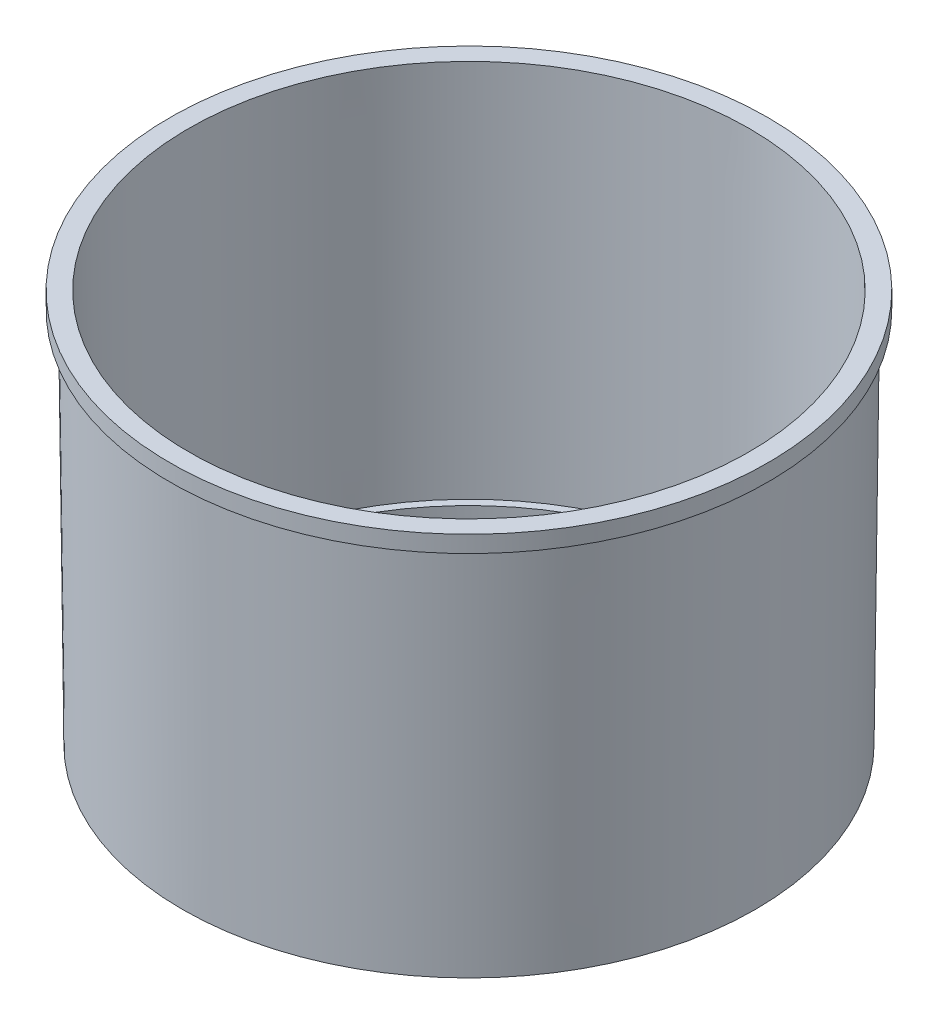
ISO-10303-21;
HEADER;
FILE_DESCRIPTION(('STEP AP214'),'2;1');
FILE_NAME('part.step','',(''),(''),'','','');
FILE_SCHEMA(('AUTOMOTIVE_DESIGN { 1 0 10303 214 1 1 1 1 }'));
ENDSEC;
DATA;
#1=APPLICATION_CONTEXT('core data for automotive mechanical design processes');
#2=APPLICATION_PROTOCOL_DEFINITION('international standard','automotive_design',2000,#1);
#3=PRODUCT_CONTEXT('',#1,'mechanical');
#4=PRODUCT('Part','Part','',(#3));
#5=PRODUCT_RELATED_PRODUCT_CATEGORY('part','',(#4));
#6=PRODUCT_DEFINITION_FORMATION('','',#4);
#7=PRODUCT_DEFINITION_CONTEXT('part definition',#1,'design');
#8=PRODUCT_DEFINITION('design','',#6,#7);
#9=PRODUCT_DEFINITION_SHAPE('','',#8);
#10=(LENGTH_UNIT() NAMED_UNIT(*) SI_UNIT(.MILLI.,.METRE.));
#11=(NAMED_UNIT(*) PLANE_ANGLE_UNIT() SI_UNIT($,.RADIAN.));
#12=(NAMED_UNIT(*) SI_UNIT($,.STERADIAN.) SOLID_ANGLE_UNIT());
#13=UNCERTAINTY_MEASURE_WITH_UNIT(LENGTH_MEASURE(1.E-05),#10,'distance_accuracy_value','');
#14=(GEOMETRIC_REPRESENTATION_CONTEXT(3) GLOBAL_UNCERTAINTY_ASSIGNED_CONTEXT((#13)) GLOBAL_UNIT_ASSIGNED_CONTEXT((#10,
#11,#12)) REPRESENTATION_CONTEXT('',''));
#15=CARTESIAN_POINT('',(0.,0.,0.));
#16=DIRECTION('',(0.,0.,1.));
#17=DIRECTION('',(1.,0.,0.));
#18=AXIS2_PLACEMENT_3D('',#15,#16,#17);
#19=CARTESIAN_POINT('',(-32.1,0.,0.));
#20=DIRECTION('',(0.,1.,0.));
#21=DIRECTION('',(0.,0.,1.));
#22=AXIS2_PLACEMENT_3D('',#19,#20,#21);
#23=PLANE('',#22);
#24=CARTESIAN_POINT('',(0.,0.,0.));
#25=DIRECTION('',(0.,-1.,0.));
#26=DIRECTION('',(0.,0.,-1.));
#27=AXIS2_PLACEMENT_3D('',#24,#25,#26);
#28=CIRCLE('',#27,32.1);
#29=CARTESIAN_POINT('',(0.,0.,-32.1));
#30=VERTEX_POINT('',#29);
#31=EDGE_CURVE('E10',#30,#30,#28,.T.);
#32=ORIENTED_EDGE('',*,*,#31,.F.);
#33=EDGE_LOOP('',(#32));
#34=FACE_BOUND('',#33,.T.);
#35=CARTESIAN_POINT('',(0.,0.,0.));
#36=DIRECTION('',(0.,-1.,0.));
#37=DIRECTION('',(0.,0.,-1.));
#38=AXIS2_PLACEMENT_3D('',#35,#36,#37);
#39=CIRCLE('',#38,34.25);
#40=CARTESIAN_POINT('',(0.,0.,-34.25));
#41=VERTEX_POINT('',#40);
#42=EDGE_CURVE('E62',#41,#41,#39,.T.);
#43=ORIENTED_EDGE('',*,*,#42,.T.);
#44=EDGE_LOOP('',(#43));
#45=FACE_BOUND('',#44,.T.);
#46=ADVANCED_FACE('F34',(#34,#45),#23,.F.);
#47=CARTESIAN_POINT('',(0.,-2.25,0.));
#48=DIRECTION('',(0.,-1.,0.));
#49=DIRECTION('',(0.,0.,-1.));
#50=AXIS2_PLACEMENT_3D('',#47,#48,#49);
#51=CYLINDRICAL_SURFACE('',#50,32.1);
#52=CARTESIAN_POINT('',(0.,2.,0.));
#53=DIRECTION('',(0.,-1.,0.));
#54=DIRECTION('',(0.,0.,-1.));
#55=AXIS2_PLACEMENT_3D('',#52,#53,#54);
#56=CIRCLE('',#55,32.1);
#57=CARTESIAN_POINT('',(0.,2.,-32.1));
#58=VERTEX_POINT('',#57);
#59=EDGE_CURVE('E40',#58,#58,#56,.T.);
#60=ORIENTED_EDGE('',*,*,#59,.F.);
#61=EDGE_LOOP('',(#60));
#62=FACE_BOUND('',#61,.T.);
#63=ORIENTED_EDGE('',*,*,#31,.T.);
#64=EDGE_LOOP('',(#63));
#65=FACE_BOUND('',#64,.T.);
#66=ADVANCED_FACE('F99',(#62,#65),#51,.F.);
#67=CARTESIAN_POINT('',(-33.0212088550612,2.,0.));
#68=DIRECTION('',(0.,-1.,0.));
#69=DIRECTION('',(0.,0.,-1.));
#70=AXIS2_PLACEMENT_3D('',#67,#68,#69);
#71=PLANE('',#70);
#72=CARTESIAN_POINT('',(0.,2.,0.));
#73=DIRECTION('',(0.,-1.,0.));
#74=DIRECTION('',(0.,0.,-1.));
#75=AXIS2_PLACEMENT_3D('',#72,#73,#74);
#76=CIRCLE('',#75,33.0212088550612);
#77=CARTESIAN_POINT('',(0.,2.,-33.0212088550612));
#78=VERTEX_POINT('',#77);
#79=EDGE_CURVE('E44',#78,#78,#76,.T.);
#80=ORIENTED_EDGE('',*,*,#79,.F.);
#81=EDGE_LOOP('',(#80));
#82=FACE_BOUND('',#81,.T.);
#83=ORIENTED_EDGE('',*,*,#59,.T.);
#84=EDGE_LOOP('',(#83));
#85=FACE_BOUND('',#84,.T.);
#86=ADVANCED_FACE('F94',(#82,#85),#71,.F.);
#87=CARTESIAN_POINT('',(0.,2.,0.));
#88=DIRECTION('',(0.,1.,0.));
#89=DIRECTION('',(0.,0.,1.));
#90=AXIS2_PLACEMENT_3D('',#87,#88,#89);
#91=CONICAL_SURFACE('',#90,33.0212088550612,0.0106394017536937);
#92=CARTESIAN_POINT('',(0.,47.,0.));
#93=DIRECTION('',(0.,-1.,0.));
#94=DIRECTION('',(0.,0.,-1.));
#95=AXIS2_PLACEMENT_3D('',#92,#93,#94);
#96=CIRCLE('',#95,33.5);
#97=CARTESIAN_POINT('',(0.,47.,-33.5));
#98=VERTEX_POINT('',#97);
#99=EDGE_CURVE('E48',#98,#98,#96,.T.);
#100=ORIENTED_EDGE('',*,*,#99,.F.);
#101=EDGE_LOOP('',(#100));
#102=FACE_BOUND('',#101,.T.);
#103=ORIENTED_EDGE('',*,*,#79,.T.);
#104=EDGE_LOOP('',(#103));
#105=FACE_BOUND('',#104,.T.);
#106=ADVANCED_FACE('F88',(#102,#105),#91,.F.);
#107=CARTESIAN_POINT('',(-35.75,47.,0.));
#108=DIRECTION('',(0.,-1.,0.));
#109=DIRECTION('',(0.,0.,-1.));
#110=AXIS2_PLACEMENT_3D('',#107,#108,#109);
#111=PLANE('',#110);
#112=CARTESIAN_POINT('',(0.,47.,0.));
#113=DIRECTION('',(0.,-1.,0.));
#114=DIRECTION('',(0.,0.,-1.));
#115=AXIS2_PLACEMENT_3D('',#112,#113,#114);
#116=CIRCLE('',#115,35.75);
#117=CARTESIAN_POINT('',(0.,47.,-35.75));
#118=VERTEX_POINT('',#117);
#119=EDGE_CURVE('E53',#118,#118,#116,.T.);
#120=ORIENTED_EDGE('',*,*,#119,.F.);
#121=EDGE_LOOP('',(#120));
#122=FACE_BOUND('',#121,.T.);
#123=ORIENTED_EDGE('',*,*,#99,.T.);
#124=EDGE_LOOP('',(#123));
#125=FACE_BOUND('',#124,.T.);
#126=ADVANCED_FACE('F82',(#122,#125),#111,.F.);
#127=CARTESIAN_POINT('',(0.,-2.25,0.));
#128=DIRECTION('',(0.,-1.,0.));
#129=DIRECTION('',(0.,0.,-1.));
#130=AXIS2_PLACEMENT_3D('',#127,#128,#129);
#131=CYLINDRICAL_SURFACE('',#130,35.75);
#132=CARTESIAN_POINT('',(0.,45.,0.));
#133=DIRECTION('',(0.,-1.,0.));
#134=DIRECTION('',(0.,0.,-1.));
#135=AXIS2_PLACEMENT_3D('',#132,#133,#134);
#136=CIRCLE('',#135,35.75);
#137=CARTESIAN_POINT('',(0.,45.,-35.75));
#138=VERTEX_POINT('',#137);
#139=EDGE_CURVE('E56',#138,#138,#136,.T.);
#140=ORIENTED_EDGE('',*,*,#139,.F.);
#141=EDGE_LOOP('',(#140));
#142=FACE_BOUND('',#141,.T.);
#143=ORIENTED_EDGE('',*,*,#119,.T.);
#144=EDGE_LOOP('',(#143));
#145=FACE_BOUND('',#144,.T.);
#146=ADVANCED_FACE('F76',(#142,#145),#131,.T.);
#147=CARTESIAN_POINT('',(-35.75,45.,0.));
#148=DIRECTION('',(0.,1.,0.));
#149=DIRECTION('',(0.,0.,1.));
#150=AXIS2_PLACEMENT_3D('',#147,#148,#149);
#151=PLANE('',#150);
#152=CARTESIAN_POINT('',(0.,45.,0.));
#153=DIRECTION('',(0.,-1.,0.));
#154=DIRECTION('',(0.,0.,-1.));
#155=AXIS2_PLACEMENT_3D('',#152,#153,#154);
#156=CIRCLE('',#155,34.7287911449388);
#157=CARTESIAN_POINT('',(0.,45.,-34.7287911449388));
#158=VERTEX_POINT('',#157);
#159=EDGE_CURVE('E59',#158,#158,#156,.T.);
#160=ORIENTED_EDGE('',*,*,#159,.F.);
#161=EDGE_LOOP('',(#160));
#162=FACE_BOUND('',#161,.T.);
#163=ORIENTED_EDGE('',*,*,#139,.T.);
#164=EDGE_LOOP('',(#163));
#165=FACE_BOUND('',#164,.T.);
#166=ADVANCED_FACE('F70',(#162,#165),#151,.F.);
#167=CARTESIAN_POINT('',(0.,45.,0.));
#168=DIRECTION('',(0.,1.,0.));
#169=DIRECTION('',(0.,0.,1.));
#170=AXIS2_PLACEMENT_3D('',#167,#168,#169);
#171=CONICAL_SURFACE('',#170,34.7287911449388,0.0106394017536937);
#172=ORIENTED_EDGE('',*,*,#42,.F.);
#173=EDGE_LOOP('',(#172));
#174=FACE_BOUND('',#173,.T.);
#175=ORIENTED_EDGE('',*,*,#159,.T.);
#176=EDGE_LOOP('',(#175));
#177=FACE_BOUND('',#176,.T.);
#178=ADVANCED_FACE('F67',(#174,#177),#171,.T.);
#179=CLOSED_SHELL('',(#46,#66,#86,#106,#126,#146,#166,#178));
#180=MANIFOLD_SOLID_BREP('B2',#179);
#181=ADVANCED_BREP_SHAPE_REPRESENTATION('',(#18,#180),#14);
#182=SHAPE_DEFINITION_REPRESENTATION(#9,#181);
ENDSEC;
END-ISO-10303-21;
